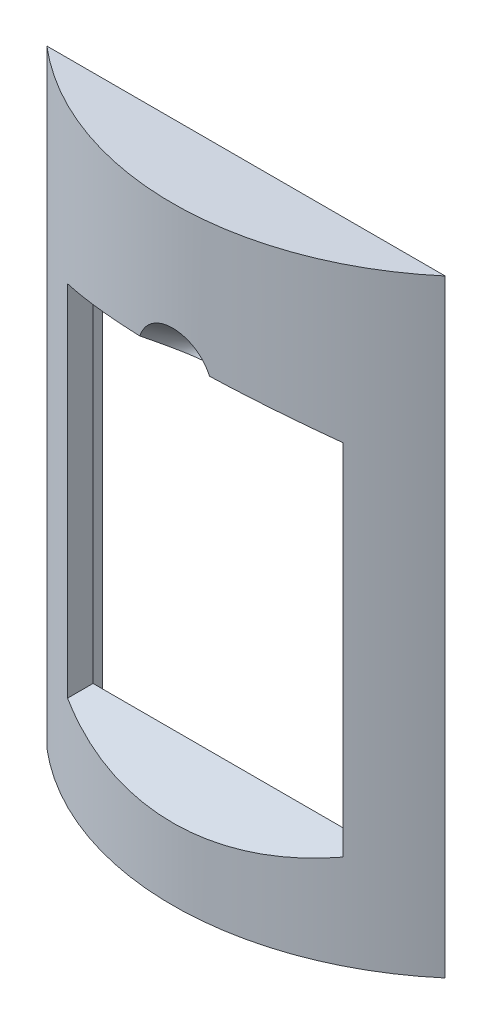
ISO-10303-21;
HEADER;
FILE_DESCRIPTION(('STEP AP214'),'2;1');
FILE_NAME('part.step','',(''),(''),'','','');
FILE_SCHEMA(('AUTOMOTIVE_DESIGN { 1 0 10303 214 1 1 1 1 }'));
ENDSEC;
DATA;
#1=APPLICATION_CONTEXT('core data for automotive mechanical design processes');
#2=APPLICATION_PROTOCOL_DEFINITION('international standard','automotive_design',2000,#1);
#3=PRODUCT_CONTEXT('',#1,'mechanical');
#4=PRODUCT('Part','Part','',(#3));
#5=PRODUCT_RELATED_PRODUCT_CATEGORY('part','',(#4));
#6=PRODUCT_DEFINITION_FORMATION('','',#4);
#7=PRODUCT_DEFINITION_CONTEXT('part definition',#1,'design');
#8=PRODUCT_DEFINITION('design','',#6,#7);
#9=PRODUCT_DEFINITION_SHAPE('','',#8);
#10=(LENGTH_UNIT() NAMED_UNIT(*) SI_UNIT(.MILLI.,.METRE.));
#11=(NAMED_UNIT(*) PLANE_ANGLE_UNIT() SI_UNIT($,.RADIAN.));
#12=(NAMED_UNIT(*) SI_UNIT($,.STERADIAN.) SOLID_ANGLE_UNIT());
#13=UNCERTAINTY_MEASURE_WITH_UNIT(LENGTH_MEASURE(1.E-05),#10,'distance_accuracy_value','');
#14=(GEOMETRIC_REPRESENTATION_CONTEXT(3) GLOBAL_UNCERTAINTY_ASSIGNED_CONTEXT((#13)) GLOBAL_UNIT_ASSIGNED_CONTEXT((#10,
#11,#12)) REPRESENTATION_CONTEXT('',''));
#15=CARTESIAN_POINT('',(0.,0.,0.));
#16=DIRECTION('',(0.,0.,1.));
#17=DIRECTION('',(1.,0.,0.));
#18=AXIS2_PLACEMENT_3D('',#15,#16,#17);
#19=CARTESIAN_POINT('',(0.,290.,-123.732739468285));
#20=DIRECTION('',(0.,-1.,0.));
#21=DIRECTION('',(0.,0.,-1.));
#22=AXIS2_PLACEMENT_3D('',#19,#20,#21);
#23=CYLINDRICAL_SURFACE('',#22,146.428571428571);
#24=CARTESIAN_POINT('',(0.,0.,-123.732739468285));
#25=DIRECTION('',(0.,1.,0.));
#26=DIRECTION('',(0.,0.,1.));
#27=AXIS2_PLACEMENT_3D('',#24,#25,#26);
#28=CIRCLE('',#27,146.428571428571);
#29=CARTESIAN_POINT('',(-95.,0.,-12.3041680397137));
#30=VERTEX_POINT('',#29);
#31=CARTESIAN_POINT('',(95.,0.,-12.3041680397137));
#32=VERTEX_POINT('',#31);
#33=EDGE_CURVE('E284',#30,#32,#28,.T.);
#34=ORIENTED_EDGE('',*,*,#33,.T.);
#35=DIRECTION('',(0.,-1.,0.));
#36=VECTOR('',#35,1.);
#37=CARTESIAN_POINT('',(95.,290.,-12.3041680397137));
#38=LINE('',#37,#36);
#39=CARTESIAN_POINT('',(95.,290.,-12.3041680397137));
#40=VERTEX_POINT('',#39);
#41=EDGE_CURVE('E291',#40,#32,#38,.T.);
#42=ORIENTED_EDGE('',*,*,#41,.F.);
#43=CARTESIAN_POINT('',(0.,290.,-123.732739468285));
#44=DIRECTION('',(0.,1.,0.));
#45=DIRECTION('',(0.,0.,1.));
#46=AXIS2_PLACEMENT_3D('',#43,#44,#45);
#47=CIRCLE('',#46,146.428571428571);
#48=CARTESIAN_POINT('',(-95.,290.,-12.3041680397137));
#49=VERTEX_POINT('',#48);
#50=EDGE_CURVE('E278',#49,#40,#47,.T.);
#51=ORIENTED_EDGE('',*,*,#50,.F.);
#52=DIRECTION('',(0.,-1.,0.));
#53=VECTOR('',#52,1.);
#54=CARTESIAN_POINT('',(-95.,290.,-12.3041680397137));
#55=LINE('',#54,#53);
#56=EDGE_CURVE('E294',#49,#30,#55,.T.);
#57=ORIENTED_EDGE('',*,*,#56,.T.);
#58=EDGE_LOOP('',(#34,#42,#51,#57));
#59=FACE_BOUND('',#58,.T.);
#60=CARTESIAN_POINT('',(-14.4593668156727,209.330849692829,21.9801744260779));
#61=CARTESIAN_POINT('',(-14.727431383192,209.726684965976,21.9535736003615));
#62=CARTESIAN_POINT('',(-14.9801361308556,210.132854676642,21.9277518091597));
#63=CARTESIAN_POINT('',(-15.4537840868956,210.963559157536,21.8782622340028));
#64=CARTESIAN_POINT('',(-15.6747228480216,211.388096488435,21.8545947518217));
#65=CARTESIAN_POINT('',(-16.0838886406862,212.253238036134,21.8099603493791));
#66=CARTESIAN_POINT('',(-16.2720862620255,212.693856272492,21.7889958614521));
#67=CARTESIAN_POINT('',(-16.6146622414431,213.588192941941,21.7502809970361));
#68=CARTESIAN_POINT('',(-16.7690393451144,214.041911860232,21.7325307397677));
#69=CARTESIAN_POINT('',(-17.0573831288252,215.007104580189,21.6990158858617));
#70=CARTESIAN_POINT('',(-17.1876095679429,215.519713507314,21.6836441442642));
#71=CARTESIAN_POINT('',(-17.4053108645957,216.55407484256,21.6577475023875));
#72=CARTESIAN_POINT('',(-17.4927824703135,217.075827943038,21.6472229707776));
#73=CARTESIAN_POINT('',(-17.6244875372332,218.124889653626,21.6313151769962));
#74=CARTESIAN_POINT('',(-17.668717179614,218.652198750246,21.6259323689058));
#75=CARTESIAN_POINT('',(-17.7136798350243,219.70868703279,21.6204599759518));
#76=CARTESIAN_POINT('',(-17.7144132388978,220.237866201867,21.6203703435253));
#77=CARTESIAN_POINT('',(-17.6720547388736,221.302640730293,21.6255264982505));
#78=CARTESIAN_POINT('',(-17.6282854708081,221.838208883427,21.6308547497555));
#79=CARTESIAN_POINT('',(-17.4961384807539,222.903742145213,21.6468192244958));
#80=CARTESIAN_POINT('',(-17.4077600137875,223.433707160142,21.6574555363762));
#81=CARTESIAN_POINT('',(-17.1868941949929,224.484262240239,21.6837298637274));
#82=CARTESIAN_POINT('',(-17.0544052919712,225.004851975036,21.6993680550943));
#83=CARTESIAN_POINT('',(-16.7460801874683,226.032874293927,21.7351930630032));
#84=CARTESIAN_POINT('',(-16.5702442454647,226.540306956761,21.7553798523169));
#85=CARTESIAN_POINT('',(-16.1765322654826,227.537563610575,21.7996812950618));
#86=CARTESIAN_POINT('',(-15.9587179834157,228.027412229544,21.8237901705413));
#87=CARTESIAN_POINT('',(-15.482162468179,228.986615201162,21.8752499519257));
#88=CARTESIAN_POINT('',(-15.2234210485002,229.455969460404,21.9026008726048));
#89=CARTESIAN_POINT('',(-14.6665707601949,230.370556209766,21.9597329943394));
#90=CARTESIAN_POINT('',(-14.3684626847489,230.81578918564,21.9895141464249));
#91=CARTESIAN_POINT('',(-13.7347177408293,231.678587689055,22.0506112755191));
#92=CARTESIAN_POINT('',(-13.3990816327501,232.096153776911,22.0819272214226));
#93=CARTESIAN_POINT('',(-12.6997007793495,232.891879845965,22.1444856286386));
#94=CARTESIAN_POINT('',(-12.3366763381171,233.270673777707,22.1757163482647));
#95=CARTESIAN_POINT('',(-11.5790024069589,233.995245906214,22.237797506037));
#96=CARTESIAN_POINT('',(-11.1843531664159,234.341024363281,22.2686479471798));
#97=CARTESIAN_POINT('',(-10.3661420357063,234.996481717693,22.3290208767051));
#98=CARTESIAN_POINT('',(-9.94258539173431,235.306167137824,22.3585436044398));
#99=CARTESIAN_POINT('',(-9.06947138595386,235.886658830046,22.4153447925856));
#100=CARTESIAN_POINT('',(-8.61991497632481,236.157466524678,22.4426233350961));
#101=CARTESIAN_POINT('',(-7.71668372633955,236.647520739853,22.4930297566869));
#102=CARTESIAN_POINT('',(-7.26390352375448,236.868404286695,22.516280534245));
#103=CARTESIAN_POINT('',(-6.34065947825275,237.269907436786,22.5592154164253));
#104=CARTESIAN_POINT('',(-5.87019607836577,237.450528047986,22.5788996103319));
#105=CARTESIAN_POINT('',(-4.91518081633654,237.769718496035,22.6140943666444));
#106=CARTESIAN_POINT('',(-4.43063238194459,237.908298471597,22.6296059352375));
#107=CARTESIAN_POINT('',(-3.45105623063012,238.142075030391,22.6559785029779));
#108=CARTESIAN_POINT('',(-2.95602883756299,238.237272952317,22.6668396456284));
#109=CARTESIAN_POINT('',(-1.9808141007038,238.380174379051,22.6832106489861));
#110=CARTESIAN_POINT('',(-1.50090264845181,238.429742289856,22.6889303265797));
#111=CARTESIAN_POINT('',(-0.538575289277394,238.48778061897,22.6956319733033));
#112=CARTESIAN_POINT('',(-0.0561594629551391,238.4962523518,22.6966140939711));
#113=CARTESIAN_POINT('',(0.907563728856242,238.472019813276,22.6938122082424));
#114=CARTESIAN_POINT('',(1.38887121680538,238.439320333511,22.6900287564731));
#115=CARTESIAN_POINT('',(2.34689350109617,238.333067742965,22.677806983449));
#116=CARTESIAN_POINT('',(2.82360830914037,238.25951473631,22.6693686740585));
#117=CARTESIAN_POINT('',(3.76066612917392,238.073901675777,22.6482692526915));
#118=CARTESIAN_POINT('',(4.22114963056675,237.96254077271,22.6356849266462));
#119=CARTESIAN_POINT('',(5.13117148070946,237.702066471929,22.606608859478));
#120=CARTESIAN_POINT('',(5.58071001401364,237.552953711271,22.5901171842913));
#121=CARTESIAN_POINT('',(6.46586776746826,237.218269201267,22.5536759236453));
#122=CARTESIAN_POINT('',(6.90148647118973,237.032696101054,22.5337262100678));
#123=CARTESIAN_POINT('',(7.75599267630314,236.626655578915,22.4909048186256));
#124=CARTESIAN_POINT('',(8.17487984832195,236.406187470477,22.4680330832757));
#125=CARTESIAN_POINT('',(9.00121647889675,235.927573768628,22.4195072915921));
#126=CARTESIAN_POINT('',(9.40829033225993,235.668784363449,22.3938081368236));
#127=CARTESIAN_POINT('',(10.1998612943938,235.11889183396,22.3406898469297));
#128=CARTESIAN_POINT('',(10.5843582223821,234.827788450952,22.3132706980352));
#129=CARTESIAN_POINT('',(11.3285619939889,234.215470913934,22.2574297171816));
#130=CARTESIAN_POINT('',(11.6882659643175,233.894253280089,22.2290077695817));
#131=CARTESIAN_POINT('',(12.3808314132082,233.224081417834,22.1718948349612));
#132=CARTESIAN_POINT('',(12.7136912324673,232.875125477494,22.1432038314317));
#133=CARTESIAN_POINT('',(13.364079233771,232.13681405015,22.0850884904829));
#134=CARTESIAN_POINT('',(13.6803847591673,231.746379517719,22.0556836378106));
#135=CARTESIAN_POINT('',(14.2801093936452,230.940936162378,21.9981624954757));
#136=CARTESIAN_POINT('',(14.5635276980794,230.525926738571,21.9700462373512));
#137=CARTESIAN_POINT('',(15.0959710974867,229.674194154736,21.9158438877918));
#138=CARTESIAN_POINT('',(15.3449908967588,229.237467665375,21.8897581092213));
#139=CARTESIAN_POINT('',(15.8072644476027,228.345338557499,21.8403039733644));
#140=CARTESIAN_POINT('',(16.020517776114,227.88993571815,21.816935648222));
#141=CARTESIAN_POINT('',(16.417944177134,226.944934289783,21.7726530109496));
#142=CARTESIAN_POINT('',(16.6006137241046,226.454696472344,21.7518741652638));
#143=CARTESIAN_POINT('',(16.9250596575171,225.460713019982,21.7144865904964));
#144=CARTESIAN_POINT('',(17.0668349784889,224.956967033487,21.6978779700686));
#145=CARTESIAN_POINT('',(17.3087278644547,223.939386986778,21.6692870702452));
#146=CARTESIAN_POINT('',(17.4088410270846,223.42555186647,21.6573052797679));
#147=CARTESIAN_POINT('',(17.5668451319774,222.391341349671,21.638298977672));
#148=CARTESIAN_POINT('',(17.6247357256448,221.870965899219,21.6312745069818));
#149=CARTESIAN_POINT('',(17.6988143276706,220.815298087054,21.622274031159));
#150=CARTESIAN_POINT('',(17.7140232698689,220.279935765637,21.6204165590601));
#151=CARTESIAN_POINT('',(17.6998587173924,219.20980367592,21.6221420352348));
#152=CARTESIAN_POINT('',(17.6704844387982,218.675033918205,21.6257250791705));
#153=CARTESIAN_POINT('',(17.5673149367638,217.60982303771,21.6382296809799));
#154=CARTESIAN_POINT('',(17.4935169261231,217.079382188647,21.6471515738194));
#155=CARTESIAN_POINT('',(17.3019151051403,216.026619067345,21.6700787971112));
#156=CARTESIAN_POINT('',(17.1841113780239,215.504296779753,21.6840841179494));
#157=CARTESIAN_POINT('',(16.9045725956709,214.469297842948,21.7168457100829));
#158=CARTESIAN_POINT('',(16.742652510598,213.956671769695,21.7356219684472));
#159=CARTESIAN_POINT('',(16.3760409644429,212.947113549941,21.7773489241044));
#160=CARTESIAN_POINT('',(16.1713491785845,212.450181522643,21.8002996530949));
#161=CARTESIAN_POINT('',(15.7203940861496,211.475719068954,21.849701649442));
#162=CARTESIAN_POINT('',(15.4741304066774,210.998188816643,21.876152948198));
#163=CARTESIAN_POINT('',(14.9415080752167,210.066198673928,21.9317707083848));
#164=CARTESIAN_POINT('',(14.655150004656,209.611738449104,21.9609371304403));
#165=CARTESIAN_POINT('',(14.0483140383835,208.735570086362,22.0206928454757));
#166=CARTESIAN_POINT('',(13.7283610586735,208.313496743923,22.0512569733844));
#167=CARTESIAN_POINT('',(13.0531421814881,207.498660208673,22.1132646157949));
#168=CARTESIAN_POINT('',(12.6978763934178,207.105896925059,22.144708127572));
#169=CARTESIAN_POINT('',(11.9543592581516,206.353013367634,22.2075187053577));
#170=CARTESIAN_POINT('',(11.5661120296282,205.992889029496,22.2388857804099));
#171=CARTESIAN_POINT('',(10.7592022232869,205.308392313698,22.3005778198992));
#172=CARTESIAN_POINT('',(10.340540628852,204.984018780966,22.330902817983));
#173=CARTESIAN_POINT('',(9.49069065612213,204.384546048018,22.3885401937726));
#174=CARTESIAN_POINT('',(9.06043410418264,204.108132099193,22.4159204422925));
#175=CARTESIAN_POINT('',(8.1772766713941,203.593900238541,22.4679933854629));
#176=CARTESIAN_POINT('',(7.72437623082623,203.35608157666,22.4926861323388));
#177=CARTESIAN_POINT('',(6.79930987489688,202.921340659816,22.5386189560232));
#178=CARTESIAN_POINT('',(6.32714867769863,202.724408460329,22.5598598721223));
#179=CARTESIAN_POINT('',(5.36701976245913,202.373314489084,22.5982291877168));
#180=CARTESIAN_POINT('',(4.87905261892326,202.21915116473,22.6153577364961));
#181=CARTESIAN_POINT('',(3.91345029403974,201.961128862718,22.6442878212811));
#182=CARTESIAN_POINT('',(3.43634343818989,201.855312821212,22.6562949641248));
#183=CARTESIAN_POINT('',(2.47470571097549,201.685118672281,22.675708363767));
#184=CARTESIAN_POINT('',(1.99017507690457,201.620739243193,22.6831147673105));
#185=CARTESIAN_POINT('',(1.01741026884269,201.534054443545,22.6931050906734));
#186=CARTESIAN_POINT('',(0.529176836015698,201.511740865057,22.6956899512759));
#187=CARTESIAN_POINT('',(-0.447391507420977,201.509383618065,22.6959625493265));
#188=CARTESIAN_POINT('',(-0.935726416598536,201.529339388814,22.6936503517392));
#189=CARTESIAN_POINT('',(-1.89486166164528,201.610145728174,22.684334160914));
#190=CARTESIAN_POINT('',(-2.36576382657457,201.66980948873,22.6774663468902));
#191=CARTESIAN_POINT('',(-3.30083874171745,201.828277581691,22.659369833381));
#192=CARTESIAN_POINT('',(-3.76501163534215,201.927081078692,22.6481412269728));
#193=CARTESIAN_POINT('',(-4.6834804071977,202.162950239549,22.6216341273154));
#194=CARTESIAN_POINT('',(-5.13777477758239,202.300021701002,22.606355020433));
#195=CARTESIAN_POINT('',(-6.03334453524851,202.611207810253,22.5721685712368));
#196=CARTESIAN_POINT('',(-6.47461987608887,202.785322590171,22.5532612159822));
#197=CARTESIAN_POINT('',(-7.34466239397443,203.170609971026,22.5121703028332));
#198=CARTESIAN_POINT('',(-7.77330465350289,203.3820619264,22.4899622630511));
#199=CARTESIAN_POINT('',(-8.61171448339513,203.839316269994,22.4429809410406));
#200=CARTESIAN_POINT('',(-9.02148131397839,204.085120003034,22.4182075583926));
#201=CARTESIAN_POINT('',(-9.81940646374805,204.608967916759,22.3667661483716));
#202=CARTESIAN_POINT('',(-10.2075768037414,204.886993891071,22.3400991941812));
#203=CARTESIAN_POINT('',(-10.9601922744344,205.47317623408,22.285557774951));
#204=CARTESIAN_POINT('',(-11.324640977913,205.781328047869,22.2576834928082));
#205=CARTESIAN_POINT('',(-12.201139649197,206.584352738894,22.18756681811));
#206=CARTESIAN_POINT('',(-12.6975220118847,207.096462632617,22.1450068547098));
#207=CARTESIAN_POINT('',(-13.6270687344237,208.175033966871,22.0611138626157));
#208=CARTESIAN_POINT('',(-14.060242990137,208.741486876391,22.0197806426718));
#209=CARTESIAN_POINT('',(-14.4593668156727,209.330849692829,21.9801744260779));
#210=B_SPLINE_CURVE_WITH_KNOTS('',3,(#60,#61,#62,#63,#64,#65,#66,#67,#68,#69,#70,#71,#72,#73,
#74,#75,#76,#77,#78,#79,#80,#81,#82,#83,#84,#85,#86,#87,#88,#89,#90,#91,#92,#93,#94,#95,#96,#97,
#98,#99,#100,#101,#102,#103,#104,#105,#106,#107,#108,#109,#110,#111,#112,#113,#114,#115,#116,
#117,#118,#119,#120,#121,#122,#123,#124,#125,#126,#127,#128,#129,#130,#131,#132,#133,#134,#135,
#136,#137,#138,#139,#140,#141,#142,#143,#144,#145,#146,#147,#148,#149,#150,#151,#152,#153,#154,
#155,#156,#157,#158,#159,#160,#161,#162,#163,#164,#165,#166,#167,#168,#169,#170,#171,#172,#173,
#174,#175,#176,#177,#178,#179,#180,#181,#182,#183,#184,#185,#186,#187,#188,#189,#190,#191,#192,
#193,#194,#195,#196,#197,#198,#199,#200,#201,#202,#203,#204,#205,#206,#207,#208,#209),
.UNSPECIFIED.,.T.,.F.,(4,2,2,2,2,2,2,2,2,2,2,2,2,2,2,2,2,2,2,2,2,2,2,2,2,2,2,2,2,2,2,2,2,2,2,2,
2,2,2,2,2,2,2,2,2,2,2,2,2,2,2,2,2,2,2,2,2,2,2,2,2,2,2,2,2,2,2,2,2,2,2,2,2,2,4),(0.,
1.43588472539297,2.87197027986331,4.30933923201361,5.74676148732095,7.33224320672552,
8.91784549483952,10.5035877993658,12.0893158548869,13.6995465948414,15.3098042266875,
16.9201184910529,18.5304231162278,20.13837659979,21.7463374111685,23.3542658294359,
24.9621616736971,26.5369795167372,28.1117849424992,29.6863053243671,31.2607680796501,
32.7718367814639,34.2828676506039,35.7935338223611,37.30415337449,38.7498867211449,
40.1955738236076,41.6410926895888,43.0866078712901,44.5067297197493,45.9268276054728,
47.3469781161361,48.7671565697939,50.2146840364098,51.6622230923783,53.1099296245526,
54.5577255745526,56.0660463799916,57.5744040815405,59.0829937388117,60.5916012390413,
62.1605239363994,63.729487507231,65.2986168255051,66.8677590985836,68.4726124652846,
70.0774940509067,71.682476339302,73.287455592294,74.8992728133912,76.5111022738673,
78.1229461930652,79.7347667405658,81.3243622549176,82.9139528445822,84.503345219566,
86.092686227827,87.6271435502021,89.1615710486303,90.6956249008415,92.2296230565829,
93.6943574853077,95.1590451925358,96.6234470789329,98.0878295386037,99.5102995232087,
100.932739148093,102.355394389653,103.77805470545,105.211848918828,106.645699278858,
108.078743391502,109.511571167724,111.649808400596,113.787710511012),.UNSPECIFIED.);
#211=CARTESIAN_POINT('',(-16.6015509345367,226.430687246487,21.7516756323829));
#212=VERTEX_POINT('',#211);
#213=CARTESIAN_POINT('',(16.6015509345257,226.430687246472,21.7516756323613));
#214=VERTEX_POINT('',#213);
#215=EDGE_CURVE('E50',#212,#214,#210,.T.);
#216=ORIENTED_EDGE('',*,*,#215,.T.);
#217=CARTESIAN_POINT('',(0.,124.561403100968,-123.732739468285));
#218=DIRECTION('',(0.,0.819152044288991,-0.573576436351047));
#219=DIRECTION('',(0.,-0.573576436351047,-0.819152044288991));
#220=AXIS2_PLACEMENT_3D('',#217,#218,#219);
#221=ELLIPSE('',#220,178.756279068642,146.428571428571);
#222=CARTESIAN_POINT('',(65.6570008926507,216.207000892651,7.15073834459512));
#223=VERTEX_POINT('',#222);
#224=EDGE_CURVE('E145',#223,#214,#221,.F.);
#225=ORIENTED_EDGE('',*,*,#224,.F.);
#226=DIRECTION('',(0.,-1.,0.));
#227=VECTOR('',#226,1.);
#228=CARTESIAN_POINT('',(65.6570008926507,290.,7.15073834459508));
#229=LINE('',#228,#227);
#230=CARTESIAN_POINT('',(65.6570008926507,44.9929991073493,7.15073834459508));
#231=VERTEX_POINT('',#230);
#232=EDGE_CURVE('E153',#231,#223,#229,.F.);
#233=ORIENTED_EDGE('',*,*,#232,.F.);
#234=CARTESIAN_POINT('',(0.,136.638596899032,-123.732739468285));
#235=DIRECTION('',(0.,-0.819152044288991,-0.573576436351047));
#236=DIRECTION('',(0.,-0.573576436351047,0.819152044288991));
#237=AXIS2_PLACEMENT_3D('',#234,#235,#236);
#238=ELLIPSE('',#237,178.756279068642,146.428571428571);
#239=CARTESIAN_POINT('',(-65.6570008926507,44.9929991073493,7.15073834459507));
#240=VERTEX_POINT('',#239);
#241=EDGE_CURVE('E159',#231,#240,#238,.T.);
#242=ORIENTED_EDGE('',*,*,#241,.T.);
#243=DIRECTION('',(0.,-1.,0.));
#244=VECTOR('',#243,1.);
#245=CARTESIAN_POINT('',(-65.6570008926507,290.,7.15073834459506));
#246=LINE('',#245,#244);
#247=CARTESIAN_POINT('',(-65.6570008926507,216.207000892651,7.15073834459504));
#248=VERTEX_POINT('',#247);
#249=EDGE_CURVE('E161',#240,#248,#246,.F.);
#250=ORIENTED_EDGE('',*,*,#249,.T.);
#251=EDGE_CURVE('E148',#212,#248,#221,.F.);
#252=ORIENTED_EDGE('',*,*,#251,.F.);
#253=EDGE_LOOP('',(#216,#225,#233,#242,#250,#252));
#254=FACE_BOUND('',#253,.T.);
#255=ADVANCED_FACE('F36',(#59,#254),#23,.T.);
#256=CARTESIAN_POINT('',(0.,290.,0.));
#257=DIRECTION('',(0.,0.,1.));
#258=DIRECTION('',(1.,0.,0.));
#259=AXIS2_PLACEMENT_3D('',#256,#257,#258);
#260=PLANE('',#259);
#261=CARTESIAN_POINT('',(0.,220.,0.));
#262=DIRECTION('',(0.,0.,1.));
#263=DIRECTION('',(1.,0.,0.));
#264=AXIS2_PLACEMENT_3D('',#261,#262,#263);
#265=CIRCLE('',#264,3.96261050550515);
#266=CARTESIAN_POINT('',(3.96261050550514,220.,0.));
#267=VERTEX_POINT('',#266);
#268=EDGE_CURVE('E11',#267,#267,#265,.T.);
#269=ORIENTED_EDGE('',*,*,#268,.T.);
#270=EDGE_LOOP('',(#269));
#271=FACE_BOUND('',#270,.T.);
#272=DIRECTION('',(0.,1.,0.));
#273=VECTOR('',#272,1.);
#274=CARTESIAN_POINT('',(-60.65,0.,0.));
#275=LINE('',#274,#273);
#276=CARTESIAN_POINT('',(-60.65,50.,0.));
#277=VERTEX_POINT('',#276);
#278=CARTESIAN_POINT('',(-60.65,211.2,0.));
#279=VERTEX_POINT('',#278);
#280=EDGE_CURVE('E210',#277,#279,#275,.T.);
#281=ORIENTED_EDGE('',*,*,#280,.F.);
#282=DIRECTION('',(-1.,0.,0.));
#283=VECTOR('',#282,1.);
#284=CARTESIAN_POINT('',(0.,50.,0.));
#285=LINE('',#284,#283);
#286=CARTESIAN_POINT('',(60.65,50.,0.));
#287=VERTEX_POINT('',#286);
#288=EDGE_CURVE('E58',#287,#277,#285,.T.);
#289=ORIENTED_EDGE('',*,*,#288,.F.);
#290=DIRECTION('',(0.,1.,0.));
#291=VECTOR('',#290,1.);
#292=CARTESIAN_POINT('',(60.65,0.,0.));
#293=LINE('',#292,#291);
#294=CARTESIAN_POINT('',(60.65,211.2,0.));
#295=VERTEX_POINT('',#294);
#296=EDGE_CURVE('E365',#287,#295,#293,.T.);
#297=ORIENTED_EDGE('',*,*,#296,.T.);
#298=DIRECTION('',(-1.,0.,0.));
#299=VECTOR('',#298,1.);
#300=CARTESIAN_POINT('',(0.,211.2,0.));
#301=LINE('',#300,#299);
#302=EDGE_CURVE('E369',#295,#279,#301,.T.);
#303=ORIENTED_EDGE('',*,*,#302,.T.);
#304=EDGE_LOOP('',(#281,#289,#297,#303));
#305=FACE_BOUND('',#304,.T.);
#306=DIRECTION('',(-1.,0.,0.));
#307=VECTOR('',#306,1.);
#308=CARTESIAN_POINT('',(0.,0.,0.));
#309=LINE('',#308,#307);
#310=CARTESIAN_POINT('',(12.5,0.,0.));
#311=VERTEX_POINT('',#310);
#312=CARTESIAN_POINT('',(-12.5,0.,0.));
#313=VERTEX_POINT('',#312);
#314=EDGE_CURVE('E212',#311,#313,#309,.T.);
#315=ORIENTED_EDGE('',*,*,#314,.T.);
#316=DIRECTION('',(0.,1.,0.));
#317=VECTOR('',#316,1.);
#318=CARTESIAN_POINT('',(-12.5,0.,0.));
#319=LINE('',#318,#317);
#320=CARTESIAN_POINT('',(-12.5,30.6,0.));
#321=VERTEX_POINT('',#320);
#322=EDGE_CURVE('E215',#313,#321,#319,.T.);
#323=ORIENTED_EDGE('',*,*,#322,.T.);
#324=DIRECTION('',(-1.,0.,0.));
#325=VECTOR('',#324,1.);
#326=CARTESIAN_POINT('',(0.,30.6,0.));
#327=LINE('',#326,#325);
#328=CARTESIAN_POINT('',(-68.5,30.6,0.));
#329=VERTEX_POINT('',#328);
#330=EDGE_CURVE('E239',#321,#329,#327,.T.);
#331=ORIENTED_EDGE('',*,*,#330,.T.);
#332=DIRECTION('',(0.,-1.,0.));
#333=VECTOR('',#332,1.);
#334=CARTESIAN_POINT('',(-68.5,290.,0.));
#335=LINE('',#334,#333);
#336=CARTESIAN_POINT('',(-68.5,232.6,0.));
#337=VERTEX_POINT('',#336);
#338=EDGE_CURVE('E163',#337,#329,#335,.T.);
#339=ORIENTED_EDGE('',*,*,#338,.F.);
#340=DIRECTION('',(-1.,0.,0.));
#341=VECTOR('',#340,1.);
#342=CARTESIAN_POINT('',(0.,232.6,0.));
#343=LINE('',#342,#341);
#344=CARTESIAN_POINT('',(68.5,232.6,0.));
#345=VERTEX_POINT('',#344);
#346=EDGE_CURVE('E259',#345,#337,#343,.T.);
#347=ORIENTED_EDGE('',*,*,#346,.F.);
#348=DIRECTION('',(0.,-1.,0.));
#349=VECTOR('',#348,1.);
#350=CARTESIAN_POINT('',(68.5,290.,0.));
#351=LINE('',#350,#349);
#352=CARTESIAN_POINT('',(68.5,30.6,0.));
#353=VERTEX_POINT('',#352);
#354=EDGE_CURVE('E281',#345,#353,#351,.T.);
#355=ORIENTED_EDGE('',*,*,#354,.T.);
#356=DIRECTION('',(-1.,0.,0.));
#357=VECTOR('',#356,1.);
#358=CARTESIAN_POINT('',(0.,30.6,0.));
#359=LINE('',#358,#357);
#360=CARTESIAN_POINT('',(12.5,30.6,0.));
#361=VERTEX_POINT('',#360);
#362=EDGE_CURVE('E261',#353,#361,#359,.T.);
#363=ORIENTED_EDGE('',*,*,#362,.T.);
#364=DIRECTION('',(0.,1.,0.));
#365=VECTOR('',#364,1.);
#366=CARTESIAN_POINT('',(12.5,0.,0.));
#367=LINE('',#366,#365);
#368=EDGE_CURVE('E218',#311,#361,#367,.T.);
#369=ORIENTED_EDGE('',*,*,#368,.F.);
#370=EDGE_LOOP('',(#315,#323,#331,#339,#347,#355,#363,#369));
#371=FACE_BOUND('',#370,.T.);
#372=ADVANCED_FACE('F192',(#271,#305,#371),#260,.F.);
#373=CARTESIAN_POINT('',(-68.5,290.,-7.49999999999999));
#374=DIRECTION('',(-1.,0.,0.));
#375=DIRECTION('',(0.,0.,1.));
#376=AXIS2_PLACEMENT_3D('',#373,#374,#375);
#377=PLANE('',#376);
#378=ORIENTED_EDGE('',*,*,#338,.T.);
#379=DIRECTION('',(0.,0.,1.));
#380=VECTOR('',#379,1.);
#381=CARTESIAN_POINT('',(-68.5,30.6,-160.842917192923));
#382=LINE('',#381,#380);
#383=CARTESIAN_POINT('',(-68.5,30.6,-12.3041680397137));
#384=VERTEX_POINT('',#383);
#385=EDGE_CURVE('E233',#384,#329,#382,.T.);
#386=ORIENTED_EDGE('',*,*,#385,.F.);
#387=DIRECTION('',(0.,-1.,0.));
#388=VECTOR('',#387,1.);
#389=CARTESIAN_POINT('',(-68.5,290.,-12.3041680397137));
#390=LINE('',#389,#388);
#391=CARTESIAN_POINT('',(-68.5,232.6,-12.3041680397136));
#392=VERTEX_POINT('',#391);
#393=EDGE_CURVE('E296',#392,#384,#390,.T.);
#394=ORIENTED_EDGE('',*,*,#393,.F.);
#395=DIRECTION('',(0.,0.,1.));
#396=VECTOR('',#395,1.);
#397=CARTESIAN_POINT('',(-68.5,232.6,-160.842917192923));
#398=LINE('',#397,#396);
#399=EDGE_CURVE('E272',#392,#337,#398,.T.);
#400=ORIENTED_EDGE('',*,*,#399,.T.);
#401=EDGE_LOOP('',(#378,#386,#394,#400));
#402=FACE_BOUND('',#401,.T.);
#403=ADVANCED_FACE('F196',(#402),#377,.F.);
#404=CARTESIAN_POINT('',(68.5,290.,-7.49999999999999));
#405=DIRECTION('',(1.,0.,0.));
#406=DIRECTION('',(0.,0.,-1.));
#407=AXIS2_PLACEMENT_3D('',#404,#405,#406);
#408=PLANE('',#407);
#409=DIRECTION('',(0.,-1.,0.));
#410=VECTOR('',#409,1.);
#411=CARTESIAN_POINT('',(68.5,290.,-12.3041680397137));
#412=LINE('',#411,#410);
#413=CARTESIAN_POINT('',(68.5,232.6,-12.3041680397137));
#414=VERTEX_POINT('',#413);
#415=CARTESIAN_POINT('',(68.5,30.6,-12.3041680397137));
#416=VERTEX_POINT('',#415);
#417=EDGE_CURVE('E289',#414,#416,#412,.T.);
#418=ORIENTED_EDGE('',*,*,#417,.T.);
#419=DIRECTION('',(0.,0.,1.));
#420=VECTOR('',#419,1.);
#421=CARTESIAN_POINT('',(68.5,30.6,-160.842917192923));
#422=LINE('',#421,#420);
#423=EDGE_CURVE('E263',#416,#353,#422,.T.);
#424=ORIENTED_EDGE('',*,*,#423,.T.);
#425=ORIENTED_EDGE('',*,*,#354,.F.);
#426=DIRECTION('',(0.,0.,1.));
#427=VECTOR('',#426,1.);
#428=CARTESIAN_POINT('',(68.5,232.6,-160.842917192923));
#429=LINE('',#428,#427);
#430=EDGE_CURVE('E270',#414,#345,#429,.T.);
#431=ORIENTED_EDGE('',*,*,#430,.F.);
#432=EDGE_LOOP('',(#418,#424,#425,#431));
#433=FACE_BOUND('',#432,.T.);
#434=ADVANCED_FACE('F198',(#433),#408,.F.);
#435=CARTESIAN_POINT('',(68.5,290.,-12.3041680397137));
#436=DIRECTION('',(0.,0.,1.));
#437=DIRECTION('',(1.,0.,0.));
#438=AXIS2_PLACEMENT_3D('',#435,#436,#437);
#439=PLANE('',#438);
#440=DIRECTION('',(-1.,0.,0.));
#441=VECTOR('',#440,1.);
#442=CARTESIAN_POINT('',(68.5,0.,-12.3041680397137));
#443=LINE('',#442,#441);
#444=CARTESIAN_POINT('',(12.5,0.,-12.3041680397136));
#445=VERTEX_POINT('',#444);
#446=EDGE_CURVE('E279',#32,#445,#443,.T.);
#447=ORIENTED_EDGE('',*,*,#446,.T.);
#448=DIRECTION('',(0.,-1.,0.));
#449=VECTOR('',#448,1.);
#450=CARTESIAN_POINT('',(12.5,0.,-12.3041680397136));
#451=LINE('',#450,#449);
#452=CARTESIAN_POINT('',(12.5,30.6,-12.3041680397136));
#453=VERTEX_POINT('',#452);
#454=EDGE_CURVE('E255',#453,#445,#451,.T.);
#455=ORIENTED_EDGE('',*,*,#454,.F.);
#456=DIRECTION('',(1.,0.,0.));
#457=VECTOR('',#456,1.);
#458=CARTESIAN_POINT('',(0.,30.6,-12.3041680397136));
#459=LINE('',#458,#457);
#460=EDGE_CURVE('E252',#453,#416,#459,.T.);
#461=ORIENTED_EDGE('',*,*,#460,.T.);
#462=ORIENTED_EDGE('',*,*,#417,.F.);
#463=DIRECTION('',(1.,0.,0.));
#464=VECTOR('',#463,1.);
#465=CARTESIAN_POINT('',(0.,232.6,-12.3041680397136));
#466=LINE('',#465,#464);
#467=EDGE_CURVE('E223',#392,#414,#466,.T.);
#468=ORIENTED_EDGE('',*,*,#467,.F.);
#469=ORIENTED_EDGE('',*,*,#393,.T.);
#470=DIRECTION('',(1.,0.,0.));
#471=VECTOR('',#470,1.);
#472=CARTESIAN_POINT('',(0.,30.6,-12.3041680397136));
#473=LINE('',#472,#471);
#474=CARTESIAN_POINT('',(-12.5,30.6,-12.3041680397136));
#475=VERTEX_POINT('',#474);
#476=EDGE_CURVE('E250',#384,#475,#473,.T.);
#477=ORIENTED_EDGE('',*,*,#476,.T.);
#478=DIRECTION('',(0.,-1.,0.));
#479=VECTOR('',#478,1.);
#480=CARTESIAN_POINT('',(-12.5,0.,-12.3041680397136));
#481=LINE('',#480,#479);
#482=CARTESIAN_POINT('',(-12.5,0.,-12.3041680397136));
#483=VERTEX_POINT('',#482);
#484=EDGE_CURVE('E232',#475,#483,#481,.T.);
#485=ORIENTED_EDGE('',*,*,#484,.T.);
#486=DIRECTION('',(-1.,0.,0.));
#487=VECTOR('',#486,1.);
#488=CARTESIAN_POINT('',(-68.5,0.,-12.3041680397137));
#489=LINE('',#488,#487);
#490=EDGE_CURVE('E222',#483,#30,#489,.T.);
#491=ORIENTED_EDGE('',*,*,#490,.T.);
#492=ORIENTED_EDGE('',*,*,#56,.F.);
#493=DIRECTION('',(-1.,0.,0.));
#494=VECTOR('',#493,1.);
#495=CARTESIAN_POINT('',(-68.5,290.,-12.3041680397137));
#496=LINE('',#495,#494);
#497=EDGE_CURVE('E276',#40,#49,#496,.T.);
#498=ORIENTED_EDGE('',*,*,#497,.F.);
#499=ORIENTED_EDGE('',*,*,#41,.T.);
#500=EDGE_LOOP('',(#447,#455,#461,#462,#468,#469,#477,#485,#491,#492,#498,#499));
#501=FACE_BOUND('',#500,.T.);
#502=ADVANCED_FACE('F194',(#501),#439,.F.);
#503=CARTESIAN_POINT('',(0.,290.,-123.732739468285));
#504=DIRECTION('',(0.,1.,0.));
#505=DIRECTION('',(0.,0.,1.));
#506=AXIS2_PLACEMENT_3D('',#503,#504,#505);
#507=PLANE('',#506);
#508=ORIENTED_EDGE('',*,*,#50,.T.);
#509=ORIENTED_EDGE('',*,*,#497,.T.);
#510=EDGE_LOOP('',(#508,#509));
#511=FACE_BOUND('',#510,.T.);
#512=ADVANCED_FACE('F313',(#511),#507,.T.);
#513=CARTESIAN_POINT('',(0.,0.,-123.732739468285));
#514=DIRECTION('',(0.,1.,0.));
#515=DIRECTION('',(0.,0.,1.));
#516=AXIS2_PLACEMENT_3D('',#513,#514,#515);
#517=PLANE('',#516);
#518=ORIENTED_EDGE('',*,*,#490,.F.);
#519=DIRECTION('',(0.,0.,1.));
#520=VECTOR('',#519,1.);
#521=CARTESIAN_POINT('',(-12.5,0.,-160.842917192923));
#522=LINE('',#521,#520);
#523=EDGE_CURVE('E226',#483,#313,#522,.T.);
#524=ORIENTED_EDGE('',*,*,#523,.T.);
#525=ORIENTED_EDGE('',*,*,#314,.F.);
#526=DIRECTION('',(0.,0.,1.));
#527=VECTOR('',#526,1.);
#528=CARTESIAN_POINT('',(12.5,0.,-160.842917192923));
#529=LINE('',#528,#527);
#530=EDGE_CURVE('E256',#445,#311,#529,.T.);
#531=ORIENTED_EDGE('',*,*,#530,.F.);
#532=ORIENTED_EDGE('',*,*,#446,.F.);
#533=ORIENTED_EDGE('',*,*,#33,.F.);
#534=EDGE_LOOP('',(#518,#524,#525,#531,#532,#533));
#535=FACE_BOUND('',#534,.T.);
#536=ADVANCED_FACE('F227',(#535),#517,.F.);
#537=CARTESIAN_POINT('',(0.,232.6,-160.842917192923));
#538=DIRECTION('',(0.,1.,0.));
#539=DIRECTION('',(0.,0.,1.));
#540=AXIS2_PLACEMENT_3D('',#537,#538,#539);
#541=PLANE('',#540);
#542=ORIENTED_EDGE('',*,*,#399,.F.);
#543=ORIENTED_EDGE('',*,*,#467,.T.);
#544=ORIENTED_EDGE('',*,*,#430,.T.);
#545=ORIENTED_EDGE('',*,*,#346,.T.);
#546=EDGE_LOOP('',(#542,#543,#544,#545));
#547=FACE_BOUND('',#546,.T.);
#548=ADVANCED_FACE('F320',(#547),#541,.F.);
#549=CARTESIAN_POINT('',(0.,30.6,-160.842917192923));
#550=DIRECTION('',(0.,1.,0.));
#551=DIRECTION('',(-1.,0.,0.));
#552=AXIS2_PLACEMENT_3D('',#549,#550,#551);
#553=PLANE('',#552);
#554=ORIENTED_EDGE('',*,*,#460,.F.);
#555=DIRECTION('',(0.,0.,1.));
#556=VECTOR('',#555,1.);
#557=CARTESIAN_POINT('',(12.5,30.6,-160.842917192923));
#558=LINE('',#557,#556);
#559=EDGE_CURVE('E265',#453,#361,#558,.T.);
#560=ORIENTED_EDGE('',*,*,#559,.T.);
#561=ORIENTED_EDGE('',*,*,#362,.F.);
#562=ORIENTED_EDGE('',*,*,#423,.F.);
#563=EDGE_LOOP('',(#554,#560,#561,#562));
#564=FACE_BOUND('',#563,.T.);
#565=ADVANCED_FACE('F335',(#564),#553,.T.);
#566=CARTESIAN_POINT('',(12.5,0.,-160.842917192923));
#567=DIRECTION('',(1.,0.,0.));
#568=DIRECTION('',(0.,0.,-1.));
#569=AXIS2_PLACEMENT_3D('',#566,#567,#568);
#570=PLANE('',#569);
#571=ORIENTED_EDGE('',*,*,#559,.F.);
#572=ORIENTED_EDGE('',*,*,#454,.T.);
#573=ORIENTED_EDGE('',*,*,#530,.T.);
#574=ORIENTED_EDGE('',*,*,#368,.T.);
#575=EDGE_LOOP('',(#571,#572,#573,#574));
#576=FACE_BOUND('',#575,.T.);
#577=ADVANCED_FACE('F341',(#576),#570,.F.);
#578=CARTESIAN_POINT('',(-12.5,0.,-160.842917192923));
#579=DIRECTION('',(1.,0.,0.));
#580=DIRECTION('',(0.,1.,0.));
#581=AXIS2_PLACEMENT_3D('',#578,#579,#580);
#582=PLANE('',#581);
#583=ORIENTED_EDGE('',*,*,#484,.F.);
#584=DIRECTION('',(0.,0.,1.));
#585=VECTOR('',#584,1.);
#586=CARTESIAN_POINT('',(-12.5,30.6,-160.842917192923));
#587=LINE('',#586,#585);
#588=EDGE_CURVE('E237',#475,#321,#587,.T.);
#589=ORIENTED_EDGE('',*,*,#588,.T.);
#590=ORIENTED_EDGE('',*,*,#322,.F.);
#591=ORIENTED_EDGE('',*,*,#523,.F.);
#592=EDGE_LOOP('',(#583,#589,#590,#591));
#593=FACE_BOUND('',#592,.T.);
#594=ADVANCED_FACE('F235',(#593),#582,.T.);
#595=CARTESIAN_POINT('',(0.,30.6,-160.842917192923));
#596=DIRECTION('',(0.,1.,0.));
#597=DIRECTION('',(-1.,0.,0.));
#598=AXIS2_PLACEMENT_3D('',#595,#596,#597);
#599=PLANE('',#598);
#600=ORIENTED_EDGE('',*,*,#476,.F.);
#601=ORIENTED_EDGE('',*,*,#385,.T.);
#602=ORIENTED_EDGE('',*,*,#330,.F.);
#603=ORIENTED_EDGE('',*,*,#588,.F.);
#604=EDGE_LOOP('',(#600,#601,#602,#603));
#605=FACE_BOUND('',#604,.T.);
#606=ADVANCED_FACE('F306',(#605),#599,.T.);
#607=CARTESIAN_POINT('',(0.,50.,0.));
#608=DIRECTION('',(0.,-0.819152044288991,-0.573576436351047));
#609=DIRECTION('',(0.,0.573576436351047,-0.819152044288991));
#610=AXIS2_PLACEMENT_3D('',#607,#608,#609);
#611=PLANE('',#610);
#612=ORIENTED_EDGE('',*,*,#241,.F.);
#613=DIRECTION('',(0.497542812164524,-0.497542812164524,0.710564775461629));
#614=VECTOR('',#613,1.);
#615=CARTESIAN_POINT('',(45.6361622513463,65.0138377486537,-21.4419824542893));
#616=LINE('',#615,#614);
#617=EDGE_CURVE('E240',#231,#287,#616,.F.);
#618=ORIENTED_EDGE('',*,*,#617,.T.);
#619=ORIENTED_EDGE('',*,*,#288,.T.);
#620=DIRECTION('',(0.497542812164524,0.497542812164524,-0.710564775461629));
#621=VECTOR('',#620,1.);
#622=CARTESIAN_POINT('',(-45.6361622513463,65.0138377486537,-21.4419824542893));
#623=LINE('',#622,#621);
#624=EDGE_CURVE('E363',#240,#277,#623,.T.);
#625=ORIENTED_EDGE('',*,*,#624,.F.);
#626=EDGE_LOOP('',(#612,#618,#619,#625));
#627=FACE_BOUND('',#626,.T.);
#628=ADVANCED_FACE('F181',(#627),#611,.F.);
#629=CARTESIAN_POINT('',(60.65,0.,0.));
#630=DIRECTION('',(0.819152044288991,0.,-0.573576436351047));
#631=DIRECTION('',(-0.573576436351047,0.,-0.819152044288991));
#632=AXIS2_PLACEMENT_3D('',#629,#630,#631);
#633=PLANE('',#632);
#634=ORIENTED_EDGE('',*,*,#232,.T.);
#635=DIRECTION('',(-0.497542812164524,-0.497542812164524,-0.710564775461629));
#636=VECTOR('',#635,1.);
#637=CARTESIAN_POINT('',(45.6361622513463,196.186162251346,-21.4419824542893));
#638=LINE('',#637,#636);
#639=EDGE_CURVE('E158',#223,#295,#638,.T.);
#640=ORIENTED_EDGE('',*,*,#639,.T.);
#641=ORIENTED_EDGE('',*,*,#296,.F.);
#642=ORIENTED_EDGE('',*,*,#617,.F.);
#643=EDGE_LOOP('',(#634,#640,#641,#642));
#644=FACE_BOUND('',#643,.T.);
#645=ADVANCED_FACE('F351',(#644),#633,.F.);
#646=CARTESIAN_POINT('',(0.,211.2,0.));
#647=DIRECTION('',(0.,0.819152044288991,-0.573576436351047));
#648=DIRECTION('',(0.,0.573576436351047,0.819152044288991));
#649=AXIS2_PLACEMENT_3D('',#646,#647,#648);
#650=PLANE('',#649);
#651=CARTESIAN_POINT('',(-17.0754501751212,227.091932666041,22.6960319602863));
#652=CARTESIAN_POINT('',(-16.8475710593663,226.770209820902,22.2365641202773));
#653=CARTESIAN_POINT('',(-16.6164199953501,226.449241259274,21.778173508762));
#654=CARTESIAN_POINT('',(-16.1467274484835,225.809056706778,20.8638952161674));
#655=CARTESIAN_POINT('',(-15.9081853282636,225.489840869866,20.4080077549609));
#656=CARTESIAN_POINT('',(-15.4223294042214,224.852708958793,19.4980890861299));
#657=CARTESIAN_POINT('',(-15.1749961888635,224.534797744282,19.0440648188062));
#658=CARTESIAN_POINT('',(-14.6710670379208,223.901405747017,18.1394873004253));
#659=CARTESIAN_POINT('',(-14.4144713474255,223.585924900221,17.688933957908));
#660=CARTESIAN_POINT('',(-13.8808979375128,222.94598736272,16.7750084392871));
#661=CARTESIAN_POINT('',(-13.6035164802277,222.621641138288,16.31179402537));
#662=CARTESIAN_POINT('',(-13.0357623732768,221.976712347672,15.3907402585607));
#663=CARTESIAN_POINT('',(-12.7453901531513,221.656129657488,14.9329007285786));
#664=CARTESIAN_POINT('',(-12.1498199295432,221.019906545155,14.0242799588567));
#665=CARTESIAN_POINT('',(-11.8446362573967,220.704261721466,13.5734924330665));
#666=CARTESIAN_POINT('',(-11.2165584028463,220.078831952752,12.6802861555214));
#667=CARTESIAN_POINT('',(-10.8936664721627,219.769046269406,12.2378663493337));
#668=CARTESIAN_POINT('',(-10.3948874086626,219.311378481706,11.584249010579));
#669=CARTESIAN_POINT('',(-10.2269791300527,219.160629247012,11.3689567915336));
#670=CARTESIAN_POINT('',(-9.88543755930534,218.861283111308,10.941446204502));
#671=CARTESIAN_POINT('',(-9.7118045105312,218.71268611919,10.7292277064008));
#672=CARTESIAN_POINT('',(-9.35812193327325,218.417890172404,10.3082154626019));
#673=CARTESIAN_POINT('',(-9.17806862225658,218.271692708041,10.0994238452818));
#674=CARTESIAN_POINT('',(-8.8109723013976,217.982209795822,9.68599940120952));
#675=CARTESIAN_POINT('',(-8.62392939187974,217.838924306213,9.48136651483053));
#676=CARTESIAN_POINT('',(-8.2437200190644,217.55700478758,9.07874371623264));
#677=CARTESIAN_POINT('',(-8.05061995379085,217.418341376409,8.88071184196012));
#678=CARTESIAN_POINT('',(-7.65591084298718,217.145024538185,8.49037494424249));
#679=CARTESIAN_POINT('',(-7.45430110834924,217.010371437398,8.29807038675099));
#680=CARTESIAN_POINT('',(-7.04181880668825,216.74604223428,7.92056916219497));
#681=CARTESIAN_POINT('',(-6.83095572353637,216.616361280143,7.73536556603192));
#682=CARTESIAN_POINT('',(-6.39873964339417,216.362913011834,7.37340392683369));
#683=CARTESIAN_POINT('',(-6.17738944764977,216.239144136009,7.19664365352779));
#684=CARTESIAN_POINT('',(-5.77285855341375,216.025229196011,6.89114145835684));
#685=CARTESIAN_POINT('',(-5.59196056173302,215.933664807643,6.76037395962064));
#686=CARTESIAN_POINT('',(-5.22246923428226,215.755773749134,6.50631919899393));
#687=CARTESIAN_POINT('',(-5.03387607834379,215.669446956711,6.38303176246594));
#688=CARTESIAN_POINT('',(-4.6481776209602,215.502898958013,6.1451765700996));
#689=CARTESIAN_POINT('',(-4.45105988539443,215.422687176659,6.03062227444139));
#690=CARTESIAN_POINT('',(-4.04815949899293,215.269719301994,5.81216150914226));
#691=CARTESIAN_POINT('',(-3.84237662080877,215.196963404476,5.70825531912291));
#692=CARTESIAN_POINT('',(-3.41887626614279,215.059331616452,5.51169675539241));
#693=CARTESIAN_POINT('',(-3.20102783670624,214.994587253198,5.41923222206333));
#694=CARTESIAN_POINT('',(-2.75644511226308,214.875941113684,5.24978797440898));
#695=CARTESIAN_POINT('',(-2.52971056064033,214.822039650825,5.17280870766624));
#696=CARTESIAN_POINT('',(-2.06890782471335,214.727023230841,5.03711119685857));
#697=CARTESIAN_POINT('',(-1.83486284724781,214.685871599341,4.97834057635716));
#698=CARTESIAN_POINT('',(-1.36054895543018,214.61785325658,4.88120031572182));
#699=CARTESIAN_POINT('',(-1.12028278145008,214.59098036428,4.84282184814873));
#700=CARTESIAN_POINT('',(-0.69533305877137,214.557455718748,4.79494369245448));
#701=CARTESIAN_POINT('',(-0.511436106380526,214.54746483794,4.78067523594373));
#702=CARTESIAN_POINT('',(-0.142833234901302,214.536634780418,4.76520831088003));
#703=CARTESIAN_POINT('',(0.0418725551124778,214.535794193178,4.76400782788851));
#704=CARTESIAN_POINT('',(0.410767515090916,214.543292837037,4.77471700117023));
#705=CARTESIAN_POINT('',(0.594956502728779,214.551634978186,4.78663081342322));
#706=CARTESIAN_POINT('',(0.961434833803062,214.57725107523,4.82321439135782));
#707=CARTESIAN_POINT('',(1.14372406045513,214.594525576961,4.84788493657264));
#708=CARTESIAN_POINT('',(1.50421163399146,214.637395874897,4.9091100671174));
#709=CARTESIAN_POINT('',(1.68242722123797,214.662944330145,4.94559704255605));
#710=CARTESIAN_POINT('',(2.03495755098697,214.721747093362,5.02957609163462));
#711=CARTESIAN_POINT('',(2.20927163291031,214.755002695595,5.07707001367656));
#712=CARTESIAN_POINT('',(2.55337224187344,214.828488701096,5.18201890595604));
#713=CARTESIAN_POINT('',(2.7231582279674,214.868719933434,5.23947506022885));
#714=CARTESIAN_POINT('',(3.0578189230997,214.955399858463,5.36326682238378));
#715=CARTESIAN_POINT('',(3.22269307589251,215.001849252088,5.42960343130407));
#716=CARTESIAN_POINT('',(3.67513328940947,215.138955114818,5.62541089587373));
#717=CARTESIAN_POINT('',(3.95717678201074,215.235641019621,5.76349267809842));
#718=CARTESIAN_POINT('',(4.50536115563076,215.442868409349,6.05944406168104));
#719=CARTESIAN_POINT('',(4.77148964564236,215.553420487935,6.21732879235529));
#720=CARTESIAN_POINT('',(5.28974279747758,215.785812017269,6.54921829175613));
#721=CARTESIAN_POINT('',(5.54181501541925,215.907689732437,6.72327770774074));
#722=CARTESIAN_POINT('',(5.90961900203648,216.096966226448,6.99359255538507));
#723=CARTESIAN_POINT('',(6.03049164985877,216.161128469351,7.08522573469552));
#724=CARTESIAN_POINT('',(6.26901979630839,216.29139774164,7.2712695362541));
#725=CARTESIAN_POINT('',(6.38667521205561,216.357504821036,7.36568022992484));
#726=CARTESIAN_POINT('',(6.66626871486437,216.518749662577,7.59596172897024));
#727=CARTESIAN_POINT('',(6.82671356822303,216.614739450304,7.73304935297968));
#728=CARTESIAN_POINT('',(7.14204425031479,216.809683672642,8.0114585555372));
#729=CARTESIAN_POINT('',(7.29692947709452,216.908638426161,8.15278058953336));
#730=CARTESIAN_POINT('',(7.75402064365949,217.209411339434,8.58232882610645));
#731=CARTESIAN_POINT('',(8.0485557235367,217.415075927336,8.87604829737575));
#732=CARTESIAN_POINT('',(8.62070164708795,217.834564143806,9.47513955757966));
#733=CARTESIAN_POINT('',(8.89827912618109,218.048402591475,9.78053251038282));
#734=CARTESIAN_POINT('',(9.43839916700682,218.482157741112,10.3999990627503));
#735=CARTESIAN_POINT('',(9.7009443906873,218.70207335663,10.7140711107038));
#736=CARTESIAN_POINT('',(10.2148470023068,219.148300224135,11.3513491220856));
#737=CARTESIAN_POINT('',(10.4661158885349,219.374644863044,11.6746027669808));
#738=CARTESIAN_POINT('',(10.9572624941984,219.831363502005,12.3268645808554));
#739=CARTESIAN_POINT('',(11.1971397809851,220.061737654643,12.6558729677495));
#740=CARTESIAN_POINT('',(11.6666500686314,220.525564740737,13.3182866962281));
#741=CARTESIAN_POINT('',(11.8962934973061,220.759014210961,13.6516870918035));
#742=CARTESIAN_POINT('',(12.3467559718202,221.228686518596,14.3224486617749));
#743=CARTESIAN_POINT('',(12.5675751615432,221.464909310706,14.6598097714733));
#744=CARTESIAN_POINT('',(12.9863007174265,221.923227773418,15.3143563704491));
#745=CARTESIAN_POINT('',(13.1847334521183,222.145165561599,15.6313163802601));
#746=CARTESIAN_POINT('',(13.5754567062875,222.59081487315,16.2677695562571));
#747=CARTESIAN_POINT('',(13.7677471047582,222.814526431355,16.5872627721938));
#748=CARTESIAN_POINT('',(14.336381883787,223.488101460958,17.5492276081126));
#749=CARTESIAN_POINT('',(14.704382065734,223.940286351775,18.1950145586109));
#750=CARTESIAN_POINT('',(15.4147148715255,224.840470962312,19.4806114158495));
#751=CARTESIAN_POINT('',(15.7574109813689,225.28837684226,20.1202873055053));
#752=CARTESIAN_POINT('',(16.2599459071811,225.962901974108,21.0836090280513));
#753=CARTESIAN_POINT('',(16.4254970307361,226.188128082963,21.4052652464791));
#754=CARTESIAN_POINT('',(16.7530601648481,226.639420087208,22.0497770227997));
#755=CARTESIAN_POINT('',(16.9150722502812,226.865485964711,22.3726325551491));
#756=CARTESIAN_POINT('',(17.0754501751212,227.091932666041,22.6960319602863));
#757=B_SPLINE_CURVE_WITH_KNOTS('',3,(#651,#652,#653,#654,#655,#656,#657,#658,#659,#660,#661,
#662,#663,#664,#665,#666,#667,#668,#669,#670,#671,#672,#673,#674,#675,#676,#677,#678,#679,#680,
#681,#682,#683,#684,#685,#686,#687,#688,#689,#690,#691,#692,#693,#694,#695,#696,#697,#698,#699,
#700,#701,#702,#703,#704,#705,#706,#707,#708,#709,#710,#711,#712,#713,#714,#715,#716,#717,#718,
#719,#720,#721,#722,#723,#724,#725,#726,#727,#728,#729,#730,#731,#732,#733,#734,#735,#736,#737,
#738,#739,#740,#741,#742,#743,#744,#745,#746,#747,#748,#749,#750,#751,#752,#753,#754,#755,#756),
.UNSPECIFIED.,.F.,.F.,(4,2,2,2,2,2,2,2,2,2,2,2,2,2,2,2,2,2,2,2,2,2,2,2,2,2,2,2,2,2,2,2,2,2,2,2,
2,2,2,2,2,2,2,2,2,2,2,2,2,2,2,2,4),(0.,1.81629850332737,3.63275407392578,5.4535057339096,
7.27420925119848,9.16361051342218,11.0529493485861,12.9404951817562,14.8278015551883,
15.7633817328703,16.6989221896569,17.6350232403004,18.5711108598764,19.4991579724424,
20.4272803824256,21.3544728045224,22.2814189424632,23.004960057907,23.7284842742842,
24.4531019953655,25.1777387401938,25.913025426632,26.6483333625718,27.3815061454959,
28.1143612904626,28.6678751384428,29.2213036606114,29.7749076172984,30.3285454073872,
30.8790698237164,31.4296867569598,31.9803691772651,32.5311137249114,33.5151458926661,
34.499934486564,35.4881804153046,35.9822069850918,36.4762462696853,37.1716161846561,
37.8670611631891,39.2584061027053,40.6524057972748,42.0461578706608,43.4494143010176,
44.8527239839715,46.2545694424349,47.6563920337853,48.960885285659,50.2654042208024,
52.8751429029057,55.4333170149563,56.7117272652973,57.9901104418523),.UNSPECIFIED.);
#758=EDGE_CURVE('E150',#212,#214,#757,.T.);
#759=ORIENTED_EDGE('',*,*,#758,.F.);
#760=ORIENTED_EDGE('',*,*,#251,.T.);
#761=DIRECTION('',(-0.497542812164524,0.497542812164524,0.710564775461629));
#762=VECTOR('',#761,1.);
#763=CARTESIAN_POINT('',(-45.6361622513463,196.186162251346,-21.4419824542893));
#764=LINE('',#763,#762);
#765=EDGE_CURVE('E364',#248,#279,#764,.F.);
#766=ORIENTED_EDGE('',*,*,#765,.T.);
#767=ORIENTED_EDGE('',*,*,#302,.F.);
#768=ORIENTED_EDGE('',*,*,#639,.F.);
#769=ORIENTED_EDGE('',*,*,#224,.T.);
#770=EDGE_LOOP('',(#759,#760,#766,#767,#768,#769));
#771=FACE_BOUND('',#770,.T.);
#772=ADVANCED_FACE('F156',(#771),#650,.F.);
#773=CARTESIAN_POINT('',(-60.65,0.,0.));
#774=DIRECTION('',(-0.819152044288991,0.,-0.573576436351047));
#775=DIRECTION('',(-0.573576436351047,0.,0.819152044288991));
#776=AXIS2_PLACEMENT_3D('',#773,#774,#775);
#777=PLANE('',#776);
#778=ORIENTED_EDGE('',*,*,#624,.T.);
#779=ORIENTED_EDGE('',*,*,#280,.T.);
#780=ORIENTED_EDGE('',*,*,#765,.F.);
#781=ORIENTED_EDGE('',*,*,#249,.F.);
#782=EDGE_LOOP('',(#778,#779,#780,#781));
#783=FACE_BOUND('',#782,.T.);
#784=ADVANCED_FACE('F179',(#783),#777,.F.);
#785=CARTESIAN_POINT('',(0.,220.,0.));
#786=DIRECTION('',(0.,0.,1.));
#787=DIRECTION('',(-1.,0.,0.));
#788=AXIS2_PLACEMENT_3D('',#785,#786,#787);
#789=CONICAL_SURFACE('',#788,2.,0.62831853071796);
#790=CARTESIAN_POINT('',(0.,220.,1.58778525229247));
#791=DIRECTION('',(0.,0.,-1.));
#792=DIRECTION('',(-1.,0.,0.));
#793=AXIS2_PLACEMENT_3D('',#790,#791,#792);
#794=CIRCLE('',#793,3.15359351113021);
#795=CARTESIAN_POINT('',(-3.15359351113022,220.,1.58778525229248));
#796=VERTEX_POINT('',#795);
#797=EDGE_CURVE('E44',#796,#796,#794,.T.);
#798=ORIENTED_EDGE('',*,*,#797,.T.);
#799=EDGE_LOOP('',(#798));
#800=FACE_BOUND('',#799,.T.);
#801=ORIENTED_EDGE('',*,*,#215,.F.);
#802=ORIENTED_EDGE('',*,*,#758,.T.);
#803=EDGE_LOOP('',(#801,#802));
#804=FACE_BOUND('',#803,.T.);
#805=ADVANCED_FACE('F151',(#800,#804),#789,.F.);
#806=CARTESIAN_POINT('',(0.,220.,1.));
#807=DIRECTION('',(0.,0.,1.));
#808=DIRECTION('',(1.,0.,0.));
#809=AXIS2_PLACEMENT_3D('',#806,#807,#808);
#810=TOROIDAL_SURFACE('',#809,3.96261050550515,1.);
#811=ORIENTED_EDGE('',*,*,#268,.F.);
#812=EDGE_LOOP('',(#811));
#813=FACE_BOUND('',#812,.T.);
#814=ORIENTED_EDGE('',*,*,#797,.F.);
#815=EDGE_LOOP('',(#814));
#816=FACE_BOUND('',#815,.T.);
#817=ADVANCED_FACE('F38',(#813,#816),#810,.T.);
#818=CLOSED_SHELL('',(#255,#372,#403,#434,#502,#512,#536,#548,#565,#577,#594,#606,#628,#645,
#772,#784,#805,#817));
#819=MANIFOLD_SOLID_BREP('B2',#818);
#820=ADVANCED_BREP_SHAPE_REPRESENTATION('',(#18,#819),#14);
#821=SHAPE_DEFINITION_REPRESENTATION(#9,#820);
ENDSEC;
END-ISO-10303-21;
